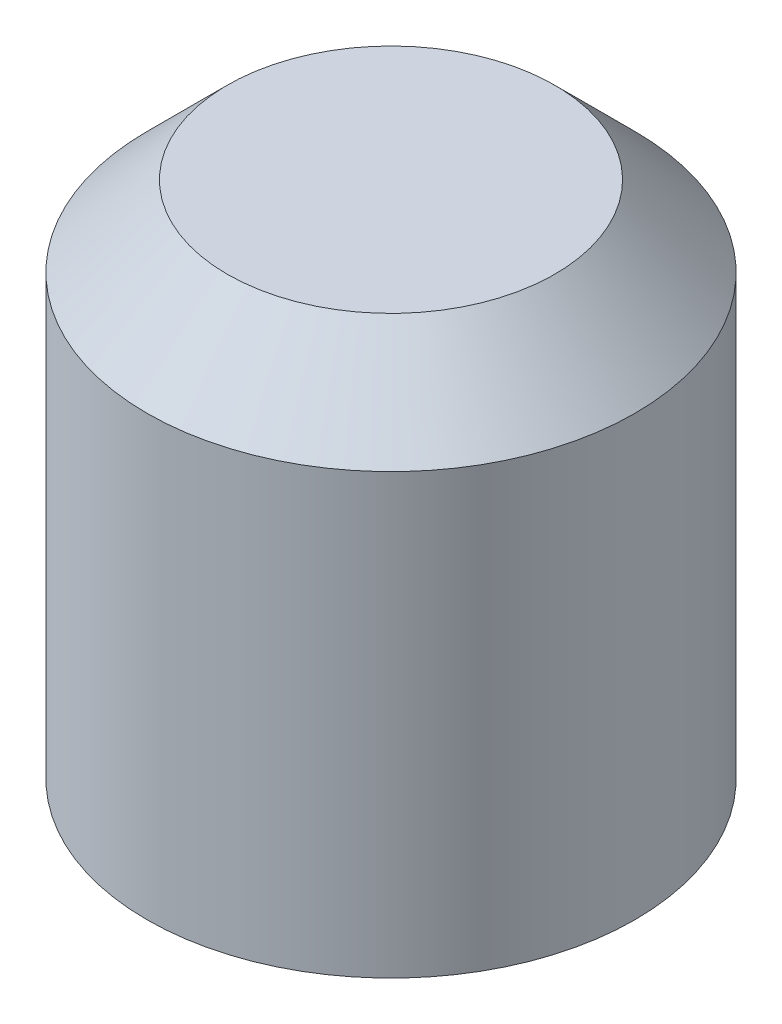
ISO-10303-21;
HEADER;
FILE_DESCRIPTION(('STEP AP214'),'2;1');
FILE_NAME('part.step','',(''),(''),'','','');
FILE_SCHEMA(('AUTOMOTIVE_DESIGN { 1 0 10303 214 1 1 1 1 }'));
ENDSEC;
DATA;
#1=APPLICATION_CONTEXT('core data for automotive mechanical design processes');
#2=APPLICATION_PROTOCOL_DEFINITION('international standard','automotive_design',2000,#1);
#3=PRODUCT_CONTEXT('',#1,'mechanical');
#4=PRODUCT('Part','Part','',(#3));
#5=PRODUCT_RELATED_PRODUCT_CATEGORY('part','',(#4));
#6=PRODUCT_DEFINITION_FORMATION('','',#4);
#7=PRODUCT_DEFINITION_CONTEXT('part definition',#1,'design');
#8=PRODUCT_DEFINITION('design','',#6,#7);
#9=PRODUCT_DEFINITION_SHAPE('','',#8);
#10=(LENGTH_UNIT() NAMED_UNIT(*) SI_UNIT(.MILLI.,.METRE.));
#11=(NAMED_UNIT(*) PLANE_ANGLE_UNIT() SI_UNIT($,.RADIAN.));
#12=(NAMED_UNIT(*) SI_UNIT($,.STERADIAN.) SOLID_ANGLE_UNIT());
#13=UNCERTAINTY_MEASURE_WITH_UNIT(LENGTH_MEASURE(1.E-05),#10,'distance_accuracy_value','');
#14=(GEOMETRIC_REPRESENTATION_CONTEXT(3) GLOBAL_UNCERTAINTY_ASSIGNED_CONTEXT((#13)) GLOBAL_UNIT_ASSIGNED_CONTEXT((#10,
#11,#12)) REPRESENTATION_CONTEXT('',''));
#15=CARTESIAN_POINT('',(0.,0.,0.));
#16=DIRECTION('',(0.,0.,1.));
#17=DIRECTION('',(1.,0.,0.));
#18=AXIS2_PLACEMENT_3D('',#15,#16,#17);
#19=CARTESIAN_POINT('',(0.,5.1308,0.));
#20=DIRECTION('',(0.,1.,0.));
#21=DIRECTION('',(0.,0.,-1.));
#22=AXIS2_PLACEMENT_3D('',#19,#20,#21);
#23=CYLINDRICAL_SURFACE('',#22,2.413);
#24=CARTESIAN_POINT('',(0.,0.,0.));
#25=DIRECTION('',(0.,1.,0.));
#26=DIRECTION('',(0.,0.,1.));
#27=AXIS2_PLACEMENT_3D('',#24,#25,#26);
#28=CIRCLE('',#27,2.413);
#29=CARTESIAN_POINT('',(0.,0.,2.413));
#30=VERTEX_POINT('',#29);
#31=EDGE_CURVE('E9',#30,#30,#28,.T.);
#32=ORIENTED_EDGE('',*,*,#31,.T.);
#33=EDGE_LOOP('',(#32));
#34=FACE_BOUND('',#33,.T.);
#35=CARTESIAN_POINT('',(0.,4.33705,0.));
#36=DIRECTION('',(0.,-1.,0.));
#37=DIRECTION('',(0.,0.,1.));
#38=AXIS2_PLACEMENT_3D('',#35,#36,#37);
#39=CIRCLE('',#38,2.413);
#40=CARTESIAN_POINT('',(0.,4.33705,2.413));
#41=VERTEX_POINT('',#40);
#42=EDGE_CURVE('E26',#41,#41,#39,.T.);
#43=ORIENTED_EDGE('',*,*,#42,.T.);
#44=EDGE_LOOP('',(#43));
#45=FACE_BOUND('',#44,.T.);
#46=ADVANCED_FACE('F15',(#34,#45),#23,.T.);
#47=CARTESIAN_POINT('',(-1.4224,0.238125,0.));
#48=DIRECTION('',(-0.612372435695794,0.707106781186547,-0.353553390593275));
#49=DIRECTION('',(-0.5,0.,0.866025403784438));
#50=AXIS2_PLACEMENT_3D('',#47,#48,#49);
#51=PLANE('',#50);
#52=DIRECTION('',(0.755928946018455,0.654653670707977,0.));
#53=VECTOR('',#52,1.);
#54=CARTESIAN_POINT('',(-1.4224,0.238125,0.));
#55=LINE('',#54,#53);
#56=CARTESIAN_POINT('',(-1.69736306570156,0.,0.));
#57=VERTEX_POINT('',#56);
#58=CARTESIAN_POINT('',(-1.4224,0.238125,0.));
#59=VERTEX_POINT('',#58);
#60=EDGE_CURVE('E203',#57,#59,#55,.T.);
#61=ORIENTED_EDGE('',*,*,#60,.F.);
#62=DIRECTION('',(-0.5,0.,0.866025403784439));
#63=VECTOR('',#62,1.);
#64=CARTESIAN_POINT('',(-1.27302229927617,0.,-0.734979767171494));
#65=LINE('',#64,#63);
#66=CARTESIAN_POINT('',(-0.848681532850778,0.,-1.46995953434299));
#67=VERTEX_POINT('',#66);
#68=EDGE_CURVE('E40',#67,#57,#65,.T.);
#69=ORIENTED_EDGE('',*,*,#68,.F.);
#70=DIRECTION('',(-0.377964473009227,-0.654653670707977,-0.654653670707977));
#71=VECTOR('',#70,1.);
#72=CARTESIAN_POINT('',(-0.7112,0.238125,-1.23183453434299));
#73=LINE('',#72,#71);
#74=CARTESIAN_POINT('',(-0.7112,0.238125,-1.23183453434299));
#75=VERTEX_POINT('',#74);
#76=EDGE_CURVE('E206',#75,#67,#73,.T.);
#77=ORIENTED_EDGE('',*,*,#76,.F.);
#78=DIRECTION('',(0.5,0.,-0.866025403784439));
#79=VECTOR('',#78,1.);
#80=CARTESIAN_POINT('',(-1.4224,0.238125,0.));
#81=LINE('',#80,#79);
#82=EDGE_CURVE('E192',#59,#75,#81,.T.);
#83=ORIENTED_EDGE('',*,*,#82,.F.);
#84=EDGE_LOOP('',(#61,#69,#77,#83));
#85=FACE_BOUND('',#84,.T.);
#86=ADVANCED_FACE('F273',(#85),#51,.F.);
#87=CARTESIAN_POINT('',(-1.4224,2.794,0.));
#88=DIRECTION('',(-0.866025403784439,0.,-0.5));
#89=DIRECTION('',(-0.5,0.,0.866025403784439));
#90=AXIS2_PLACEMENT_3D('',#87,#88,#89);
#91=PLANE('',#90);
#92=DIRECTION('',(0.,-1.,0.));
#93=VECTOR('',#92,1.);
#94=CARTESIAN_POINT('',(-1.4224,2.794,0.));
#95=LINE('',#94,#93);
#96=CARTESIAN_POINT('',(-1.4224,2.794,0.));
#97=VERTEX_POINT('',#96);
#98=EDGE_CURVE('E195',#97,#59,#95,.T.);
#99=ORIENTED_EDGE('',*,*,#98,.T.);
#100=ORIENTED_EDGE('',*,*,#82,.T.);
#101=DIRECTION('',(0.,-1.,0.));
#102=VECTOR('',#101,1.);
#103=CARTESIAN_POINT('',(-0.7112,2.794,-1.23183453434299));
#104=LINE('',#103,#102);
#105=CARTESIAN_POINT('',(-0.7112,2.794,-1.23183453434299));
#106=VERTEX_POINT('',#105);
#107=EDGE_CURVE('E196',#106,#75,#104,.T.);
#108=ORIENTED_EDGE('',*,*,#107,.F.);
#109=DIRECTION('',(0.5,0.,-0.866025403784439));
#110=VECTOR('',#109,1.);
#111=CARTESIAN_POINT('',(-1.4224,2.794,0.));
#112=LINE('',#111,#110);
#113=EDGE_CURVE('E179',#97,#106,#112,.T.);
#114=ORIENTED_EDGE('',*,*,#113,.F.);
#115=EDGE_LOOP('',(#99,#100,#108,#114));
#116=FACE_BOUND('',#115,.T.);
#117=ADVANCED_FACE('F279',(#116),#91,.F.);
#118=CARTESIAN_POINT('',(-0.7112,2.794,-1.23183453434299));
#119=DIRECTION('',(0.,0.,-1.));
#120=DIRECTION('',(0.,-1.,0.));
#121=AXIS2_PLACEMENT_3D('',#118,#119,#120);
#122=PLANE('',#121);
#123=ORIENTED_EDGE('',*,*,#107,.T.);
#124=DIRECTION('',(1.,0.,0.));
#125=VECTOR('',#124,1.);
#126=CARTESIAN_POINT('',(-0.7112,0.238125,-1.23183453434299));
#127=LINE('',#126,#125);
#128=CARTESIAN_POINT('',(0.7112,0.238125,-1.23183453434298));
#129=VERTEX_POINT('',#128);
#130=EDGE_CURVE('E176',#75,#129,#127,.T.);
#131=ORIENTED_EDGE('',*,*,#130,.T.);
#132=DIRECTION('',(0.,-1.,0.));
#133=VECTOR('',#132,1.);
#134=CARTESIAN_POINT('',(0.7112,2.794,-1.23183453434298));
#135=LINE('',#134,#133);
#136=CARTESIAN_POINT('',(0.7112,2.794,-1.23183453434298));
#137=VERTEX_POINT('',#136);
#138=EDGE_CURVE('E86',#137,#129,#135,.T.);
#139=ORIENTED_EDGE('',*,*,#138,.F.);
#140=DIRECTION('',(1.,0.,0.));
#141=VECTOR('',#140,1.);
#142=CARTESIAN_POINT('',(-0.7112,2.794,-1.23183453434299));
#143=LINE('',#142,#141);
#144=EDGE_CURVE('E178',#106,#137,#143,.T.);
#145=ORIENTED_EDGE('',*,*,#144,.F.);
#146=EDGE_LOOP('',(#123,#131,#139,#145));
#147=FACE_BOUND('',#146,.T.);
#148=ADVANCED_FACE('F286',(#147),#122,.F.);
#149=CARTESIAN_POINT('',(0.,2.794,0.));
#150=DIRECTION('',(0.,-1.,0.));
#151=DIRECTION('',(0.,0.,-1.));
#152=AXIS2_PLACEMENT_3D('',#149,#150,#151);
#153=PLANE('',#152);
#154=ORIENTED_EDGE('',*,*,#113,.T.);
#155=ORIENTED_EDGE('',*,*,#144,.T.);
#156=DIRECTION('',(0.5,0.,0.866025403784439));
#157=VECTOR('',#156,1.);
#158=CARTESIAN_POINT('',(0.7112,2.794,-1.23183453434298));
#159=LINE('',#158,#157);
#160=CARTESIAN_POINT('',(1.4224,2.794,0.));
#161=VERTEX_POINT('',#160);
#162=EDGE_CURVE('E180',#137,#161,#159,.T.);
#163=ORIENTED_EDGE('',*,*,#162,.T.);
#164=DIRECTION('',(-0.5,0.,0.866025403784439));
#165=VECTOR('',#164,1.);
#166=CARTESIAN_POINT('',(1.4224,2.794,0.));
#167=LINE('',#166,#165);
#168=CARTESIAN_POINT('',(0.7112,2.794,1.23183453434299));
#169=VERTEX_POINT('',#168);
#170=EDGE_CURVE('E221',#161,#169,#167,.T.);
#171=ORIENTED_EDGE('',*,*,#170,.T.);
#172=DIRECTION('',(-1.,0.,0.));
#173=VECTOR('',#172,1.);
#174=CARTESIAN_POINT('',(0.7112,2.794,1.23183453434298));
#175=LINE('',#174,#173);
#176=CARTESIAN_POINT('',(-0.7112,2.794,1.23183453434298));
#177=VERTEX_POINT('',#176);
#178=EDGE_CURVE('E225',#169,#177,#175,.T.);
#179=ORIENTED_EDGE('',*,*,#178,.T.);
#180=DIRECTION('',(-0.5,0.,-0.866025403784439));
#181=VECTOR('',#180,1.);
#182=CARTESIAN_POINT('',(-0.7112,2.794,1.23183453434298));
#183=LINE('',#182,#181);
#184=EDGE_CURVE('E205',#177,#97,#183,.T.);
#185=ORIENTED_EDGE('',*,*,#184,.T.);
#186=EDGE_LOOP('',(#154,#155,#163,#171,#179,#185));
#187=FACE_BOUND('',#186,.T.);
#188=ADVANCED_FACE('F237',(#187),#153,.T.);
#189=CARTESIAN_POINT('',(-0.7112,0.238125,1.23183453434298));
#190=DIRECTION('',(-0.612372435695795,0.707106781186548,0.353553390593273));
#191=DIRECTION('',(0.5,0.,0.866025403784439));
#192=AXIS2_PLACEMENT_3D('',#189,#190,#191);
#193=PLANE('',#192);
#194=ORIENTED_EDGE('',*,*,#60,.T.);
#195=DIRECTION('',(-0.5,0.,-0.866025403784439));
#196=VECTOR('',#195,1.);
#197=CARTESIAN_POINT('',(-0.7112,0.238125,1.23183453434298));
#198=LINE('',#197,#196);
#199=CARTESIAN_POINT('',(-0.7112,0.238125,1.23183453434298));
#200=VERTEX_POINT('',#199);
#201=EDGE_CURVE('E160',#200,#59,#198,.T.);
#202=ORIENTED_EDGE('',*,*,#201,.F.);
#203=DIRECTION('',(0.377964473009228,0.654653670707977,-0.654653670707977));
#204=VECTOR('',#203,1.);
#205=CARTESIAN_POINT('',(-0.7112,0.238125,1.23183453434298));
#206=LINE('',#205,#204);
#207=CARTESIAN_POINT('',(-0.84868153285078,0.,1.46995953434298));
#208=VERTEX_POINT('',#207);
#209=EDGE_CURVE('E143',#208,#200,#206,.T.);
#210=ORIENTED_EDGE('',*,*,#209,.F.);
#211=DIRECTION('',(0.5,0.,0.866025403784439));
#212=VECTOR('',#211,1.);
#213=CARTESIAN_POINT('',(-1.27302229927617,0.,0.734979767171492));
#214=LINE('',#213,#212);
#215=EDGE_CURVE('E132',#57,#208,#214,.T.);
#216=ORIENTED_EDGE('',*,*,#215,.F.);
#217=EDGE_LOOP('',(#194,#202,#210,#216));
#218=FACE_BOUND('',#217,.T.);
#219=ADVANCED_FACE('F305',(#218),#193,.F.);
#220=CARTESIAN_POINT('',(-0.7112,0.238125,-1.23183453434299));
#221=DIRECTION('',(0.,0.707106781186547,-0.707106781186548));
#222=DIRECTION('',(-1.,0.,0.));
#223=AXIS2_PLACEMENT_3D('',#220,#221,#222);
#224=PLANE('',#223);
#225=ORIENTED_EDGE('',*,*,#76,.T.);
#226=DIRECTION('',(-1.,0.,0.));
#227=VECTOR('',#226,1.);
#228=CARTESIAN_POINT('',(0.,0.,-1.46995953434298));
#229=LINE('',#228,#227);
#230=CARTESIAN_POINT('',(0.848681532850782,0.,-1.46995953434298));
#231=VERTEX_POINT('',#230);
#232=EDGE_CURVE('E188',#231,#67,#229,.T.);
#233=ORIENTED_EDGE('',*,*,#232,.F.);
#234=DIRECTION('',(0.377964473009228,-0.654653670707978,-0.654653670707976));
#235=VECTOR('',#234,1.);
#236=CARTESIAN_POINT('',(0.7112,0.238125,-1.23183453434298));
#237=LINE('',#236,#235);
#238=EDGE_CURVE('E71',#129,#231,#237,.T.);
#239=ORIENTED_EDGE('',*,*,#238,.F.);
#240=ORIENTED_EDGE('',*,*,#130,.F.);
#241=EDGE_LOOP('',(#225,#233,#239,#240));
#242=FACE_BOUND('',#241,.T.);
#243=ADVANCED_FACE('F245',(#242),#224,.F.);
#244=CARTESIAN_POINT('',(0.7112,2.794,-1.23183453434298));
#245=DIRECTION('',(0.866025403784439,0.,-0.5));
#246=DIRECTION('',(0.,-1.,0.));
#247=AXIS2_PLACEMENT_3D('',#244,#245,#246);
#248=PLANE('',#247);
#249=ORIENTED_EDGE('',*,*,#138,.T.);
#250=DIRECTION('',(0.5,0.,0.866025403784439));
#251=VECTOR('',#250,1.);
#252=CARTESIAN_POINT('',(0.7112,0.238125,-1.23183453434298));
#253=LINE('',#252,#251);
#254=CARTESIAN_POINT('',(1.4224,0.238125,0.));
#255=VERTEX_POINT('',#254);
#256=EDGE_CURVE('E189',#129,#255,#253,.T.);
#257=ORIENTED_EDGE('',*,*,#256,.T.);
#258=DIRECTION('',(0.,-1.,0.));
#259=VECTOR('',#258,1.);
#260=CARTESIAN_POINT('',(1.4224,2.794,0.));
#261=LINE('',#260,#259);
#262=EDGE_CURVE('E155',#161,#255,#261,.T.);
#263=ORIENTED_EDGE('',*,*,#262,.F.);
#264=ORIENTED_EDGE('',*,*,#162,.F.);
#265=EDGE_LOOP('',(#249,#257,#263,#264));
#266=FACE_BOUND('',#265,.T.);
#267=ADVANCED_FACE('F240',(#266),#248,.F.);
#268=CARTESIAN_POINT('',(-0.7112,2.794,1.23183453434298));
#269=DIRECTION('',(-0.866025403784439,0.,0.5));
#270=DIRECTION('',(0.,1.,0.));
#271=AXIS2_PLACEMENT_3D('',#268,#269,#270);
#272=PLANE('',#271);
#273=DIRECTION('',(0.,-1.,0.));
#274=VECTOR('',#273,1.);
#275=CARTESIAN_POINT('',(-0.7112,2.794,1.23183453434298));
#276=LINE('',#275,#274);
#277=EDGE_CURVE('E185',#177,#200,#276,.T.);
#278=ORIENTED_EDGE('',*,*,#277,.T.);
#279=ORIENTED_EDGE('',*,*,#201,.T.);
#280=ORIENTED_EDGE('',*,*,#98,.F.);
#281=ORIENTED_EDGE('',*,*,#184,.F.);
#282=EDGE_LOOP('',(#278,#279,#280,#281));
#283=FACE_BOUND('',#282,.T.);
#284=ADVANCED_FACE('F290',(#283),#272,.F.);
#285=CARTESIAN_POINT('',(0.7112,2.794,1.23183453434298));
#286=DIRECTION('',(0.,0.,1.));
#287=DIRECTION('',(1.,0.,0.));
#288=AXIS2_PLACEMENT_3D('',#285,#286,#287);
#289=PLANE('',#288);
#290=DIRECTION('',(0.,-1.,0.));
#291=VECTOR('',#290,1.);
#292=CARTESIAN_POINT('',(0.7112,2.794,1.23183453434299));
#293=LINE('',#292,#291);
#294=CARTESIAN_POINT('',(0.7112,0.238125,1.23183453434299));
#295=VERTEX_POINT('',#294);
#296=EDGE_CURVE('E154',#169,#295,#293,.T.);
#297=ORIENTED_EDGE('',*,*,#296,.T.);
#298=DIRECTION('',(-1.,0.,0.));
#299=VECTOR('',#298,1.);
#300=CARTESIAN_POINT('',(0.7112,0.238125,1.23183453434298));
#301=LINE('',#300,#299);
#302=EDGE_CURVE('E140',#295,#200,#301,.T.);
#303=ORIENTED_EDGE('',*,*,#302,.T.);
#304=ORIENTED_EDGE('',*,*,#277,.F.);
#305=ORIENTED_EDGE('',*,*,#178,.F.);
#306=EDGE_LOOP('',(#297,#303,#304,#305));
#307=FACE_BOUND('',#306,.T.);
#308=ADVANCED_FACE('F296',(#307),#289,.F.);
#309=CARTESIAN_POINT('',(1.4224,2.794,0.));
#310=DIRECTION('',(0.866025403784439,0.,0.5));
#311=DIRECTION('',(0.,-1.,0.));
#312=AXIS2_PLACEMENT_3D('',#309,#310,#311);
#313=PLANE('',#312);
#314=ORIENTED_EDGE('',*,*,#262,.T.);
#315=DIRECTION('',(-0.5,0.,0.866025403784439));
#316=VECTOR('',#315,1.);
#317=CARTESIAN_POINT('',(1.4224,0.238125,0.));
#318=LINE('',#317,#316);
#319=EDGE_CURVE('E164',#255,#295,#318,.T.);
#320=ORIENTED_EDGE('',*,*,#319,.T.);
#321=ORIENTED_EDGE('',*,*,#296,.F.);
#322=ORIENTED_EDGE('',*,*,#170,.F.);
#323=EDGE_LOOP('',(#314,#320,#321,#322));
#324=FACE_BOUND('',#323,.T.);
#325=ADVANCED_FACE('F292',(#324),#313,.F.);
#326=CARTESIAN_POINT('',(0.,5.1308,0.));
#327=DIRECTION('',(0.,1.,0.));
#328=DIRECTION('',(1.,0.,0.));
#329=AXIS2_PLACEMENT_3D('',#326,#327,#328);
#330=PLANE('',#329);
#331=CARTESIAN_POINT('',(0.,5.1308,0.));
#332=DIRECTION('',(0.,1.,0.));
#333=DIRECTION('',(0.,0.,1.));
#334=AXIS2_PLACEMENT_3D('',#331,#332,#333);
#335=CIRCLE('',#334,1.61925);
#336=CARTESIAN_POINT('',(0.,5.1308,1.61925));
#337=VERTEX_POINT('',#336);
#338=EDGE_CURVE('E135',#337,#337,#335,.T.);
#339=ORIENTED_EDGE('',*,*,#338,.T.);
#340=EDGE_LOOP('',(#339));
#341=FACE_BOUND('',#340,.T.);
#342=ADVANCED_FACE('F259',(#341),#330,.T.);
#343=CARTESIAN_POINT('',(0.,0.,0.));
#344=DIRECTION('',(0.,1.,0.));
#345=DIRECTION('',(1.,0.,0.));
#346=AXIS2_PLACEMENT_3D('',#343,#344,#345);
#347=PLANE('',#346);
#348=ORIENTED_EDGE('',*,*,#31,.F.);
#349=EDGE_LOOP('',(#348));
#350=FACE_BOUND('',#349,.T.);
#351=DIRECTION('',(1.,0.,0.));
#352=VECTOR('',#351,1.);
#353=CARTESIAN_POINT('',(0.,0.,1.46995953434298));
#354=LINE('',#353,#352);
#355=CARTESIAN_POINT('',(0.848681532850779,0.,1.46995953434298));
#356=VERTEX_POINT('',#355);
#357=EDGE_CURVE('E127',#208,#356,#354,.T.);
#358=ORIENTED_EDGE('',*,*,#357,.T.);
#359=DIRECTION('',(0.5,0.,-0.866025403784439));
#360=VECTOR('',#359,1.);
#361=CARTESIAN_POINT('',(1.27302229927617,0.,0.734979767171493));
#362=LINE('',#361,#360);
#363=CARTESIAN_POINT('',(1.69736306570156,0.,0.));
#364=VERTEX_POINT('',#363);
#365=EDGE_CURVE('E19',#356,#364,#362,.T.);
#366=ORIENTED_EDGE('',*,*,#365,.T.);
#367=DIRECTION('',(-0.5,0.,-0.866025403784439));
#368=VECTOR('',#367,1.);
#369=CARTESIAN_POINT('',(1.27302229927617,0.,-0.734979767171492));
#370=LINE('',#369,#368);
#371=EDGE_CURVE('E128',#364,#231,#370,.T.);
#372=ORIENTED_EDGE('',*,*,#371,.T.);
#373=ORIENTED_EDGE('',*,*,#232,.T.);
#374=ORIENTED_EDGE('',*,*,#68,.T.);
#375=ORIENTED_EDGE('',*,*,#215,.T.);
#376=EDGE_LOOP('',(#358,#366,#372,#373,#374,#375));
#377=FACE_BOUND('',#376,.T.);
#378=ADVANCED_FACE('F130',(#350,#377),#347,.F.);
#379=CARTESIAN_POINT('',(0.,5.1308,0.));
#380=DIRECTION('',(0.,-1.,0.));
#381=DIRECTION('',(0.,0.,-1.));
#382=AXIS2_PLACEMENT_3D('',#379,#380,#381);
#383=CONICAL_SURFACE('',#382,1.61925,0.785398163397448);
#384=ORIENTED_EDGE('',*,*,#42,.F.);
#385=EDGE_LOOP('',(#384));
#386=FACE_BOUND('',#385,.T.);
#387=ORIENTED_EDGE('',*,*,#338,.F.);
#388=EDGE_LOOP('',(#387));
#389=FACE_BOUND('',#388,.T.);
#390=ADVANCED_FACE('F17',(#386,#389),#383,.T.);
#391=CARTESIAN_POINT('',(1.4224,0.238125,0.));
#392=DIRECTION('',(0.612372435695795,0.707106781186547,0.353553390593275));
#393=DIRECTION('',(0.5,0.,-0.866025403784438));
#394=AXIS2_PLACEMENT_3D('',#391,#392,#393);
#395=PLANE('',#394);
#396=DIRECTION('',(0.755928946018454,-0.654653670707978,0.));
#397=VECTOR('',#396,1.);
#398=CARTESIAN_POINT('',(1.4224,0.238125,0.));
#399=LINE('',#398,#397);
#400=EDGE_CURVE('E124',#255,#364,#399,.T.);
#401=ORIENTED_EDGE('',*,*,#400,.T.);
#402=ORIENTED_EDGE('',*,*,#365,.F.);
#403=DIRECTION('',(-0.377964473009226,0.654653670707978,-0.654653670707977));
#404=VECTOR('',#403,1.);
#405=CARTESIAN_POINT('',(0.508,0.590077724097996,0.879881810244989));
#406=LINE('',#405,#404);
#407=EDGE_CURVE('E122',#356,#295,#406,.T.);
#408=ORIENTED_EDGE('',*,*,#407,.T.);
#409=ORIENTED_EDGE('',*,*,#319,.F.);
#410=EDGE_LOOP('',(#401,#402,#408,#409));
#411=FACE_BOUND('',#410,.T.);
#412=ADVANCED_FACE('F120',(#411),#395,.F.);
#413=CARTESIAN_POINT('',(0.7112,0.238125,1.23183453434298));
#414=DIRECTION('',(0.,0.707106781186547,0.707106781186548));
#415=DIRECTION('',(1.,0.,0.));
#416=AXIS2_PLACEMENT_3D('',#413,#414,#415);
#417=PLANE('',#416);
#418=ORIENTED_EDGE('',*,*,#209,.T.);
#419=ORIENTED_EDGE('',*,*,#302,.F.);
#420=ORIENTED_EDGE('',*,*,#407,.F.);
#421=ORIENTED_EDGE('',*,*,#357,.F.);
#422=EDGE_LOOP('',(#418,#419,#420,#421));
#423=FACE_BOUND('',#422,.T.);
#424=ADVANCED_FACE('F138',(#423),#417,.F.);
#425=CARTESIAN_POINT('',(0.7112,0.238125,-1.23183453434298));
#426=DIRECTION('',(0.612372435695795,0.707106781186548,-0.353553390593273));
#427=DIRECTION('',(-0.5,0.,-0.866025403784439));
#428=AXIS2_PLACEMENT_3D('',#425,#426,#427);
#429=PLANE('',#428);
#430=ORIENTED_EDGE('',*,*,#238,.T.);
#431=ORIENTED_EDGE('',*,*,#371,.F.);
#432=ORIENTED_EDGE('',*,*,#400,.F.);
#433=ORIENTED_EDGE('',*,*,#256,.F.);
#434=EDGE_LOOP('',(#430,#431,#432,#433));
#435=FACE_BOUND('',#434,.T.);
#436=ADVANCED_FACE('F243',(#435),#429,.F.);
#437=CLOSED_SHELL('',(#46,#86,#117,#148,#188,#219,#243,#267,#284,#308,#325,#342,#378,#390,#412,
#424,#436));
#438=MANIFOLD_SOLID_BREP('B1',#437);
#439=ADVANCED_BREP_SHAPE_REPRESENTATION('',(#18,#438),#14);
#440=SHAPE_DEFINITION_REPRESENTATION(#9,#439);
ENDSEC;
END-ISO-10303-21;
